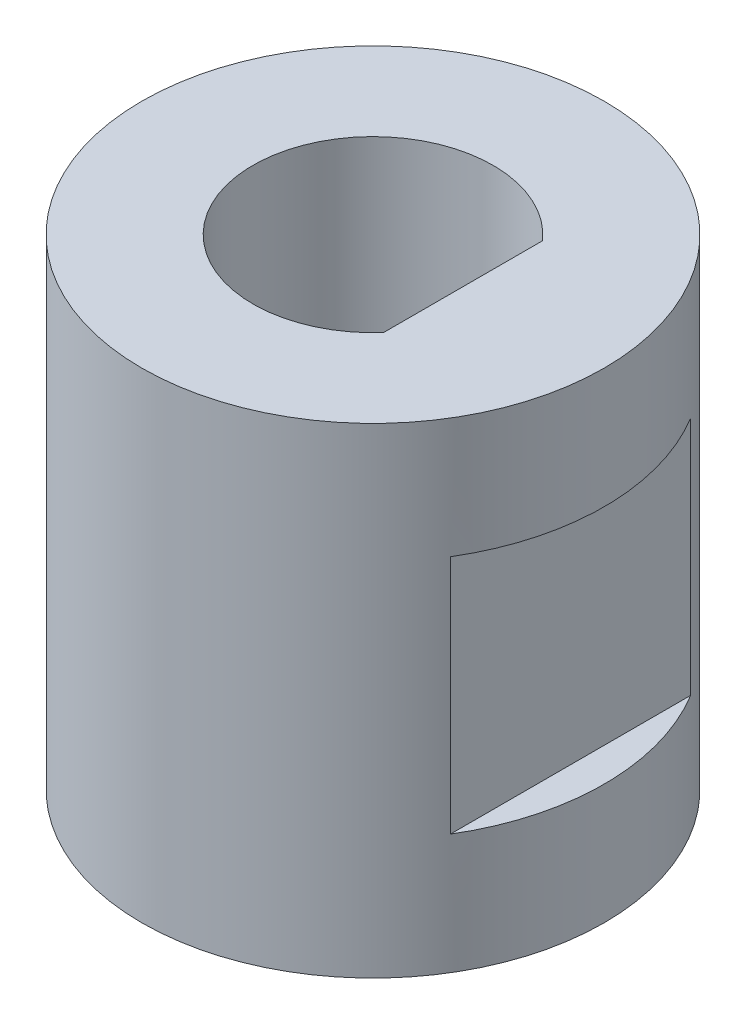
ISO-10303-21;
HEADER;
FILE_DESCRIPTION(('STEP AP214'),'2;1');
FILE_NAME('part.step','',(''),(''),'','','');
FILE_SCHEMA(('AUTOMOTIVE_DESIGN { 1 0 10303 214 1 1 1 1 }'));
ENDSEC;
DATA;
#1=APPLICATION_CONTEXT('core data for automotive mechanical design processes');
#2=APPLICATION_PROTOCOL_DEFINITION('international standard','automotive_design',2000,#1);
#3=PRODUCT_CONTEXT('',#1,'mechanical');
#4=PRODUCT('Part','Part','',(#3));
#5=PRODUCT_RELATED_PRODUCT_CATEGORY('part','',(#4));
#6=PRODUCT_DEFINITION_FORMATION('','',#4);
#7=PRODUCT_DEFINITION_CONTEXT('part definition',#1,'design');
#8=PRODUCT_DEFINITION('design','',#6,#7);
#9=PRODUCT_DEFINITION_SHAPE('','',#8);
#10=(LENGTH_UNIT() NAMED_UNIT(*) SI_UNIT(.MILLI.,.METRE.));
#11=(NAMED_UNIT(*) PLANE_ANGLE_UNIT() SI_UNIT($,.RADIAN.));
#12=(NAMED_UNIT(*) SI_UNIT($,.STERADIAN.) SOLID_ANGLE_UNIT());
#13=UNCERTAINTY_MEASURE_WITH_UNIT(LENGTH_MEASURE(1.E-05),#10,'distance_accuracy_value','');
#14=(GEOMETRIC_REPRESENTATION_CONTEXT(3) GLOBAL_UNCERTAINTY_ASSIGNED_CONTEXT((#13)) GLOBAL_UNIT_ASSIGNED_CONTEXT((#10,
#11,#12)) REPRESENTATION_CONTEXT('',''));
#15=CARTESIAN_POINT('',(0.,0.,0.));
#16=DIRECTION('',(0.,0.,1.));
#17=DIRECTION('',(1.,0.,0.));
#18=AXIS2_PLACEMENT_3D('',#15,#16,#17);
#19=CARTESIAN_POINT('',(0.,2.,0.));
#20=DIRECTION('',(0.,1.,0.));
#21=DIRECTION('',(0.,0.,1.));
#22=AXIS2_PLACEMENT_3D('',#19,#20,#21);
#23=PLANE('',#22);
#24=DIRECTION('',(0.,0.,-1.));
#25=VECTOR('',#24,1.);
#26=CARTESIAN_POINT('',(3.2897568299192,2.,-1.99999999999999));
#27=LINE('',#26,#25);
#28=CARTESIAN_POINT('',(3.28975682991919,2.,2.00000000000001));
#29=VERTEX_POINT('',#28);
#30=CARTESIAN_POINT('',(3.2897568299192,2.,-1.99999999999999));
#31=VERTEX_POINT('',#30);
#32=EDGE_CURVE('E133',#29,#31,#27,.T.);
#33=ORIENTED_EDGE('',*,*,#32,.F.);
#34=CARTESIAN_POINT('',(0.,2.,0.));
#35=DIRECTION('',(0.,1.,0.));
#36=DIRECTION('',(0.,0.,1.));
#37=AXIS2_PLACEMENT_3D('',#34,#35,#36);
#38=CIRCLE('',#37,3.85);
#39=EDGE_CURVE('E11',#29,#31,#38,.T.);
#40=ORIENTED_EDGE('',*,*,#39,.T.);
#41=EDGE_LOOP('',(#33,#40));
#42=FACE_BOUND('',#41,.T.);
#43=ADVANCED_FACE('F41',(#42),#23,.T.);
#44=CARTESIAN_POINT('',(0.,2.,0.));
#45=DIRECTION('',(0.,-1.,0.));
#46=DIRECTION('',(0.,0.,-1.));
#47=AXIS2_PLACEMENT_3D('',#44,#45,#46);
#48=CYLINDRICAL_SURFACE('',#47,3.85);
#49=DIRECTION('',(0.,-1.,0.));
#50=VECTOR('',#49,1.);
#51=CARTESIAN_POINT('',(2.00000000000005,6.,-3.28975682991917));
#52=LINE('',#51,#50);
#53=CARTESIAN_POINT('',(2.00000000000005,6.,-3.28975682991917));
#54=VERTEX_POINT('',#53);
#55=CARTESIAN_POINT('',(2.00000000000005,2.,-3.28975682991917));
#56=VERTEX_POINT('',#55);
#57=EDGE_CURVE('E155',#54,#56,#52,.T.);
#58=ORIENTED_EDGE('',*,*,#57,.F.);
#59=CARTESIAN_POINT('',(0.,6.,0.));
#60=DIRECTION('',(0.,1.,0.));
#61=DIRECTION('',(0.,0.,1.));
#62=AXIS2_PLACEMENT_3D('',#59,#60,#61);
#63=CIRCLE('',#62,3.85);
#64=CARTESIAN_POINT('',(-1.99999999999995,6.,-3.28975682991922));
#65=VERTEX_POINT('',#64);
#66=EDGE_CURVE('E117',#54,#65,#63,.T.);
#67=ORIENTED_EDGE('',*,*,#66,.T.);
#68=DIRECTION('',(0.,-1.,0.));
#69=VECTOR('',#68,1.);
#70=CARTESIAN_POINT('',(-1.99999999999995,6.,-3.28975682991922));
#71=LINE('',#70,#69);
#72=CARTESIAN_POINT('',(-1.99999999999995,2.,-3.28975682991922));
#73=VERTEX_POINT('',#72);
#74=EDGE_CURVE('E151',#65,#73,#71,.T.);
#75=ORIENTED_EDGE('',*,*,#74,.T.);
#76=EDGE_CURVE('E51',#56,#73,#38,.T.);
#77=ORIENTED_EDGE('',*,*,#76,.F.);
#78=EDGE_LOOP('',(#58,#67,#75,#77));
#79=FACE_BOUND('',#78,.T.);
#80=ORIENTED_EDGE('',*,*,#39,.F.);
#81=DIRECTION('',(0.,-1.,0.));
#82=VECTOR('',#81,1.);
#83=CARTESIAN_POINT('',(3.28975682991919,6.,2.00000000000001));
#84=LINE('',#83,#82);
#85=CARTESIAN_POINT('',(3.28975682991919,6.,2.00000000000001));
#86=VERTEX_POINT('',#85);
#87=EDGE_CURVE('E147',#86,#29,#84,.T.);
#88=ORIENTED_EDGE('',*,*,#87,.F.);
#89=CARTESIAN_POINT('',(3.2897568299192,6.,-1.99999999999999));
#90=VERTEX_POINT('',#89);
#91=EDGE_CURVE('E124',#86,#90,#63,.T.);
#92=ORIENTED_EDGE('',*,*,#91,.T.);
#93=DIRECTION('',(0.,-1.,0.));
#94=VECTOR('',#93,1.);
#95=CARTESIAN_POINT('',(3.2897568299192,6.,-1.99999999999999));
#96=LINE('',#95,#94);
#97=EDGE_CURVE('E137',#90,#31,#96,.T.);
#98=ORIENTED_EDGE('',*,*,#97,.T.);
#99=EDGE_LOOP('',(#80,#88,#92,#98));
#100=FACE_BOUND('',#99,.T.);
#101=CARTESIAN_POINT('',(0.,0.,0.));
#102=DIRECTION('',(0.,1.,0.));
#103=DIRECTION('',(0.,0.,1.));
#104=AXIS2_PLACEMENT_3D('',#101,#102,#103);
#105=CIRCLE('',#104,3.85);
#106=CARTESIAN_POINT('',(0.,0.,3.85));
#107=VERTEX_POINT('',#106);
#108=EDGE_CURVE('E45',#107,#107,#105,.T.);
#109=ORIENTED_EDGE('',*,*,#108,.T.);
#110=EDGE_LOOP('',(#109));
#111=FACE_BOUND('',#110,.T.);
#112=CARTESIAN_POINT('',(0.,8.,0.));
#113=DIRECTION('',(0.,1.,0.));
#114=DIRECTION('',(0.,0.,1.));
#115=AXIS2_PLACEMENT_3D('',#112,#113,#114);
#116=CIRCLE('',#115,3.85);
#117=CARTESIAN_POINT('',(0.,8.,3.85));
#118=VERTEX_POINT('',#117);
#119=EDGE_CURVE('E119',#118,#118,#116,.T.);
#120=ORIENTED_EDGE('',*,*,#119,.F.);
#121=EDGE_LOOP('',(#120));
#122=FACE_BOUND('',#121,.T.);
#123=ADVANCED_FACE('F43',(#79,#100,#111,#122),#48,.T.);
#124=DIRECTION('',(-1.,0.,0.));
#125=VECTOR('',#124,1.);
#126=CARTESIAN_POINT('',(-1.99999999999995,2.,-3.28975682991922));
#127=LINE('',#126,#125);
#128=EDGE_CURVE('E123',#56,#73,#127,.T.);
#129=ORIENTED_EDGE('',*,*,#128,.F.);
#130=ORIENTED_EDGE('',*,*,#76,.T.);
#131=EDGE_LOOP('',(#129,#130));
#132=FACE_BOUND('',#131,.T.);
#133=ADVANCED_FACE('F167',(#132),#23,.T.);
#134=CARTESIAN_POINT('',(0.,0.,0.));
#135=DIRECTION('',(0.,1.,0.));
#136=DIRECTION('',(0.,0.,1.));
#137=AXIS2_PLACEMENT_3D('',#134,#135,#136);
#138=PLANE('',#137);
#139=DIRECTION('',(0.,0.,-1.));
#140=VECTOR('',#139,1.);
#141=CARTESIAN_POINT('',(1.5,0.,-1.32287565553229));
#142=LINE('',#141,#140);
#143=CARTESIAN_POINT('',(1.5,0.,1.3228756555323));
#144=VERTEX_POINT('',#143);
#145=CARTESIAN_POINT('',(1.5,0.,-1.32287565553229));
#146=VERTEX_POINT('',#145);
#147=EDGE_CURVE('E99',#144,#146,#142,.T.);
#148=ORIENTED_EDGE('',*,*,#147,.T.);
#149=CARTESIAN_POINT('',(0.,0.,0.));
#150=DIRECTION('',(0.,1.,0.));
#151=DIRECTION('',(0.,0.,1.));
#152=AXIS2_PLACEMENT_3D('',#149,#150,#151);
#153=CIRCLE('',#152,2.);
#154=EDGE_CURVE('E58',#146,#144,#153,.T.);
#155=ORIENTED_EDGE('',*,*,#154,.T.);
#156=EDGE_LOOP('',(#148,#155));
#157=FACE_BOUND('',#156,.T.);
#158=ORIENTED_EDGE('',*,*,#108,.F.);
#159=EDGE_LOOP('',(#158));
#160=FACE_BOUND('',#159,.T.);
#161=ADVANCED_FACE('F106',(#157,#160),#138,.F.);
#162=CARTESIAN_POINT('',(-1.99999999999995,6.,-3.28975682991922));
#163=DIRECTION('',(0.,0.,1.));
#164=DIRECTION('',(1.,0.,0.));
#165=AXIS2_PLACEMENT_3D('',#162,#163,#164);
#166=PLANE('',#165);
#167=ORIENTED_EDGE('',*,*,#128,.T.);
#168=ORIENTED_EDGE('',*,*,#74,.F.);
#169=DIRECTION('',(-1.,0.,0.));
#170=VECTOR('',#169,1.);
#171=CARTESIAN_POINT('',(-1.99999999999995,6.,-3.28975682991922));
#172=LINE('',#171,#170);
#173=EDGE_CURVE('E128',#54,#65,#172,.T.);
#174=ORIENTED_EDGE('',*,*,#173,.F.);
#175=ORIENTED_EDGE('',*,*,#57,.T.);
#176=EDGE_LOOP('',(#167,#168,#174,#175));
#177=FACE_BOUND('',#176,.T.);
#178=ADVANCED_FACE('F169',(#177),#166,.F.);
#179=CARTESIAN_POINT('',(3.2897568299192,6.,-1.99999999999999));
#180=DIRECTION('',(-1.,0.,0.));
#181=DIRECTION('',(0.,0.,1.));
#182=AXIS2_PLACEMENT_3D('',#179,#180,#181);
#183=PLANE('',#182);
#184=ORIENTED_EDGE('',*,*,#32,.T.);
#185=ORIENTED_EDGE('',*,*,#97,.F.);
#186=DIRECTION('',(0.,0.,-1.));
#187=VECTOR('',#186,1.);
#188=CARTESIAN_POINT('',(3.2897568299192,6.,-1.99999999999999));
#189=LINE('',#188,#187);
#190=EDGE_CURVE('E132',#86,#90,#189,.T.);
#191=ORIENTED_EDGE('',*,*,#190,.F.);
#192=ORIENTED_EDGE('',*,*,#87,.T.);
#193=EDGE_LOOP('',(#184,#185,#191,#192));
#194=FACE_BOUND('',#193,.T.);
#195=ADVANCED_FACE('F178',(#194),#183,.F.);
#196=CARTESIAN_POINT('',(0.,6.,0.));
#197=DIRECTION('',(0.,1.,0.));
#198=DIRECTION('',(0.,0.,1.));
#199=AXIS2_PLACEMENT_3D('',#196,#197,#198);
#200=PLANE('',#199);
#201=ORIENTED_EDGE('',*,*,#66,.F.);
#202=ORIENTED_EDGE('',*,*,#173,.T.);
#203=EDGE_LOOP('',(#201,#202));
#204=FACE_BOUND('',#203,.T.);
#205=ADVANCED_FACE('F175',(#204),#200,.F.);
#206=ORIENTED_EDGE('',*,*,#91,.F.);
#207=ORIENTED_EDGE('',*,*,#190,.T.);
#208=EDGE_LOOP('',(#206,#207));
#209=FACE_BOUND('',#208,.T.);
#210=ADVANCED_FACE('F177',(#209),#200,.F.);
#211=CARTESIAN_POINT('',(0.,8.,0.));
#212=DIRECTION('',(0.,1.,0.));
#213=DIRECTION('',(0.,0.,1.));
#214=AXIS2_PLACEMENT_3D('',#211,#212,#213);
#215=PLANE('',#214);
#216=CARTESIAN_POINT('',(0.,8.,0.));
#217=DIRECTION('',(0.,1.,0.));
#218=DIRECTION('',(0.,0.,1.));
#219=AXIS2_PLACEMENT_3D('',#216,#217,#218);
#220=CIRCLE('',#219,2.);
#221=CARTESIAN_POINT('',(1.5,8.,-1.32287565553229));
#222=VERTEX_POINT('',#221);
#223=CARTESIAN_POINT('',(1.5,8.,1.3228756555323));
#224=VERTEX_POINT('',#223);
#225=EDGE_CURVE('E63',#222,#224,#220,.T.);
#226=ORIENTED_EDGE('',*,*,#225,.F.);
#227=DIRECTION('',(0.,0.,-1.));
#228=VECTOR('',#227,1.);
#229=CARTESIAN_POINT('',(1.5,8.,-1.32287565553229));
#230=LINE('',#229,#228);
#231=EDGE_CURVE('E109',#224,#222,#230,.T.);
#232=ORIENTED_EDGE('',*,*,#231,.F.);
#233=EDGE_LOOP('',(#226,#232));
#234=FACE_BOUND('',#233,.T.);
#235=ORIENTED_EDGE('',*,*,#119,.T.);
#236=EDGE_LOOP('',(#235));
#237=FACE_BOUND('',#236,.T.);
#238=ADVANCED_FACE('F184',(#234,#237),#215,.T.);
#239=CARTESIAN_POINT('',(0.,0.,0.));
#240=DIRECTION('',(0.,1.,0.));
#241=DIRECTION('',(0.,0.,1.));
#242=AXIS2_PLACEMENT_3D('',#239,#240,#241);
#243=CYLINDRICAL_SURFACE('',#242,2.);
#244=ORIENTED_EDGE('',*,*,#225,.T.);
#245=DIRECTION('',(0.,1.,0.));
#246=VECTOR('',#245,1.);
#247=CARTESIAN_POINT('',(1.5,0.,1.3228756555323));
#248=LINE('',#247,#246);
#249=EDGE_CURVE('E91',#144,#224,#248,.T.);
#250=ORIENTED_EDGE('',*,*,#249,.F.);
#251=ORIENTED_EDGE('',*,*,#154,.F.);
#252=DIRECTION('',(0.,1.,0.));
#253=VECTOR('',#252,1.);
#254=CARTESIAN_POINT('',(1.5,0.,-1.32287565553229));
#255=LINE('',#254,#253);
#256=EDGE_CURVE('E98',#146,#222,#255,.T.);
#257=ORIENTED_EDGE('',*,*,#256,.T.);
#258=EDGE_LOOP('',(#244,#250,#251,#257));
#259=FACE_BOUND('',#258,.T.);
#260=ADVANCED_FACE('F93',(#259),#243,.F.);
#261=CARTESIAN_POINT('',(1.5,0.,-1.32287565553229));
#262=DIRECTION('',(1.,0.,0.));
#263=DIRECTION('',(0.,0.,-1.));
#264=AXIS2_PLACEMENT_3D('',#261,#262,#263);
#265=PLANE('',#264);
#266=ORIENTED_EDGE('',*,*,#231,.T.);
#267=ORIENTED_EDGE('',*,*,#256,.F.);
#268=ORIENTED_EDGE('',*,*,#147,.F.);
#269=ORIENTED_EDGE('',*,*,#249,.T.);
#270=EDGE_LOOP('',(#266,#267,#268,#269));
#271=FACE_BOUND('',#270,.T.);
#272=ADVANCED_FACE('F102',(#271),#265,.F.);
#273=CLOSED_SHELL('',(#43,#123,#133,#161,#178,#195,#205,#210,#238,#260,#272));
#274=MANIFOLD_SOLID_BREP('B2',#273);
#275=ADVANCED_BREP_SHAPE_REPRESENTATION('',(#18,#274),#14);
#276=SHAPE_DEFINITION_REPRESENTATION(#9,#275);
ENDSEC;
END-ISO-10303-21;
